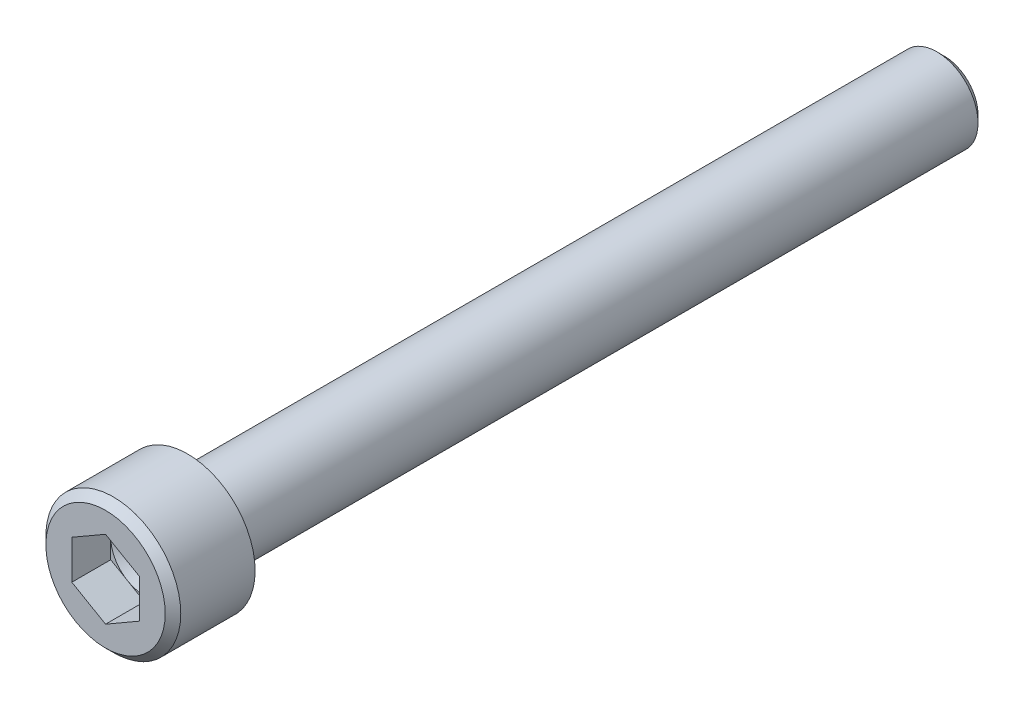
ISO-10303-21;
HEADER;
FILE_DESCRIPTION(('STEP AP214'),'2;1');
FILE_NAME('part.step','',(''),(''),'','','');
FILE_SCHEMA(('AUTOMOTIVE_DESIGN { 1 0 10303 214 1 1 1 1 }'));
ENDSEC;
DATA;
#1=APPLICATION_CONTEXT('core data for automotive mechanical design processes');
#2=APPLICATION_PROTOCOL_DEFINITION('international standard','automotive_design',2000,#1);
#3=PRODUCT_CONTEXT('',#1,'mechanical');
#4=PRODUCT('Part','Part','',(#3));
#5=PRODUCT_RELATED_PRODUCT_CATEGORY('part','',(#4));
#6=PRODUCT_DEFINITION_FORMATION('','',#4);
#7=PRODUCT_DEFINITION_CONTEXT('part definition',#1,'design');
#8=PRODUCT_DEFINITION('design','',#6,#7);
#9=PRODUCT_DEFINITION_SHAPE('','',#8);
#10=(LENGTH_UNIT() NAMED_UNIT(*) SI_UNIT(.MILLI.,.METRE.));
#11=(NAMED_UNIT(*) PLANE_ANGLE_UNIT() SI_UNIT($,.RADIAN.));
#12=(NAMED_UNIT(*) SI_UNIT($,.STERADIAN.) SOLID_ANGLE_UNIT());
#13=UNCERTAINTY_MEASURE_WITH_UNIT(LENGTH_MEASURE(1.E-05),#10,'distance_accuracy_value','');
#14=(GEOMETRIC_REPRESENTATION_CONTEXT(3) GLOBAL_UNCERTAINTY_ASSIGNED_CONTEXT((#13)) GLOBAL_UNIT_ASSIGNED_CONTEXT((#10,
#11,#12)) REPRESENTATION_CONTEXT('',''));
#15=CARTESIAN_POINT('',(0.,0.,0.));
#16=DIRECTION('',(0.,0.,1.));
#17=DIRECTION('',(1.,0.,0.));
#18=AXIS2_PLACEMENT_3D('',#15,#16,#17);
#19=CARTESIAN_POINT('',(0.,0.,2.54));
#20=DIRECTION('',(0.,0.,1.));
#21=DIRECTION('',(1.,0.,0.));
#22=AXIS2_PLACEMENT_3D('',#19,#20,#21);
#23=PLANE('',#22);
#24=DIRECTION('',(0.,1.,0.));
#25=VECTOR('',#24,1.);
#26=CARTESIAN_POINT('',(-1.9812,0.,2.54));
#27=LINE('',#26,#25);
#28=CARTESIAN_POINT('',(-1.9812,0.,2.54));
#29=VERTEX_POINT('',#28);
#30=CARTESIAN_POINT('',(-1.9812,1.14384635331848,2.54));
#31=VERTEX_POINT('',#30);
#32=EDGE_CURVE('E399',#29,#31,#27,.T.);
#33=ORIENTED_EDGE('',*,*,#32,.F.);
#34=CARTESIAN_POINT('',(0.,0.,2.54));
#35=DIRECTION('',(0.,0.,-1.));
#36=DIRECTION('',(-1.,0.,0.));
#37=AXIS2_PLACEMENT_3D('',#34,#35,#36);
#38=CIRCLE('',#37,1.9812);
#39=CARTESIAN_POINT('',(-0.9906,1.71576952997773,2.54));
#40=VERTEX_POINT('',#39);
#41=EDGE_CURVE('E33',#29,#40,#38,.T.);
#42=ORIENTED_EDGE('',*,*,#41,.T.);
#43=DIRECTION('',(0.866025403784439,0.5,0.));
#44=VECTOR('',#43,1.);
#45=CARTESIAN_POINT('',(0.163354175866616,2.38200528404682,2.54));
#46=LINE('',#45,#44);
#47=EDGE_CURVE('E395',#31,#40,#46,.T.);
#48=ORIENTED_EDGE('',*,*,#47,.F.);
#49=EDGE_LOOP('',(#33,#42,#48));
#50=FACE_BOUND('',#49,.T.);
#51=ADVANCED_FACE('F17',(#50),#23,.T.);
#52=CARTESIAN_POINT('',(0.,2.28769270663697,2.54));
#53=VERTEX_POINT('',#52);
#54=EDGE_CURVE('E392',#40,#53,#46,.T.);
#55=ORIENTED_EDGE('',*,*,#54,.F.);
#56=CARTESIAN_POINT('',(0.9906,1.71576952997773,2.54));
#57=VERTEX_POINT('',#56);
#58=EDGE_CURVE('E224',#40,#57,#38,.T.);
#59=ORIENTED_EDGE('',*,*,#58,.T.);
#60=DIRECTION('',(0.866025403784439,-0.5,0.));
#61=VECTOR('',#60,1.);
#62=CARTESIAN_POINT('',(-0.163354175866613,2.38200528404681,2.54));
#63=LINE('',#62,#61);
#64=EDGE_CURVE('E384',#53,#57,#63,.T.);
#65=ORIENTED_EDGE('',*,*,#64,.F.);
#66=EDGE_LOOP('',(#55,#59,#65));
#67=FACE_BOUND('',#66,.T.);
#68=ADVANCED_FACE('F105',(#67),#23,.T.);
#69=CARTESIAN_POINT('',(1.9812,1.14384635331849,2.54));
#70=VERTEX_POINT('',#69);
#71=EDGE_CURVE('E190',#57,#70,#63,.T.);
#72=ORIENTED_EDGE('',*,*,#71,.F.);
#73=CARTESIAN_POINT('',(1.9812,0.,2.54));
#74=VERTEX_POINT('',#73);
#75=EDGE_CURVE('E381',#57,#74,#38,.T.);
#76=ORIENTED_EDGE('',*,*,#75,.T.);
#77=DIRECTION('',(0.,-1.,0.));
#78=VECTOR('',#77,1.);
#79=CARTESIAN_POINT('',(1.9812,0.,2.54));
#80=LINE('',#79,#78);
#81=EDGE_CURVE('E160',#70,#74,#80,.T.);
#82=ORIENTED_EDGE('',*,*,#81,.F.);
#83=EDGE_LOOP('',(#72,#76,#82));
#84=FACE_BOUND('',#83,.T.);
#85=ADVANCED_FACE('F111',(#84),#23,.T.);
#86=CARTESIAN_POINT('',(1.9812,-1.14384635331849,2.54));
#87=VERTEX_POINT('',#86);
#88=EDGE_CURVE('E155',#74,#87,#80,.T.);
#89=ORIENTED_EDGE('',*,*,#88,.F.);
#90=CARTESIAN_POINT('',(0.9906,-1.71576952997773,2.54));
#91=VERTEX_POINT('',#90);
#92=EDGE_CURVE('E417',#74,#91,#38,.T.);
#93=ORIENTED_EDGE('',*,*,#92,.T.);
#94=DIRECTION('',(-0.866025403784438,-0.5,0.));
#95=VECTOR('',#94,1.);
#96=CARTESIAN_POINT('',(2.14455417586661,-1.04953377590865,2.54));
#97=LINE('',#96,#95);
#98=EDGE_CURVE('E148',#87,#91,#97,.T.);
#99=ORIENTED_EDGE('',*,*,#98,.F.);
#100=EDGE_LOOP('',(#89,#93,#99));
#101=FACE_BOUND('',#100,.T.);
#102=ADVANCED_FACE('F129',(#101),#23,.T.);
#103=CARTESIAN_POINT('',(0.,-2.28769270663697,2.54));
#104=VERTEX_POINT('',#103);
#105=EDGE_CURVE('E141',#91,#104,#97,.T.);
#106=ORIENTED_EDGE('',*,*,#105,.F.);
#107=CARTESIAN_POINT('',(-0.9906,-1.71576952997773,2.54));
#108=VERTEX_POINT('',#107);
#109=EDGE_CURVE('E143',#91,#108,#38,.T.);
#110=ORIENTED_EDGE('',*,*,#109,.T.);
#111=DIRECTION('',(-0.866025403784439,0.5,0.));
#112=VECTOR('',#111,1.);
#113=CARTESIAN_POINT('',(-2.14455417586661,-1.04953377590865,2.54));
#114=LINE('',#113,#112);
#115=EDGE_CURVE('E145',#104,#108,#114,.T.);
#116=ORIENTED_EDGE('',*,*,#115,.F.);
#117=EDGE_LOOP('',(#106,#110,#116));
#118=FACE_BOUND('',#117,.T.);
#119=ADVANCED_FACE('F119',(#118),#23,.T.);
#120=CARTESIAN_POINT('',(0.,0.,4.826));
#121=DIRECTION('',(0.,0.,1.));
#122=DIRECTION('',(1.,0.,0.));
#123=AXIS2_PLACEMENT_3D('',#120,#121,#122);
#124=PLANE('',#123);
#125=CARTESIAN_POINT('',(0.,0.,4.826));
#126=DIRECTION('',(0.,0.,1.));
#127=DIRECTION('',(1.,0.,0.));
#128=AXIS2_PLACEMENT_3D('',#125,#126,#127);
#129=CIRCLE('',#128,3.5052);
#130=CARTESIAN_POINT('',(3.5052,0.,4.826));
#131=VERTEX_POINT('',#130);
#132=EDGE_CURVE('E211',#131,#131,#129,.T.);
#133=ORIENTED_EDGE('',*,*,#132,.T.);
#134=EDGE_LOOP('',(#133));
#135=FACE_BOUND('',#134,.T.);
#136=DIRECTION('',(0.866025403784439,0.5,0.));
#137=VECTOR('',#136,1.);
#138=CARTESIAN_POINT('',(0.163354175866616,2.38200528404682,4.826));
#139=LINE('',#138,#137);
#140=CARTESIAN_POINT('',(-1.9812,1.14384635331848,4.826));
#141=VERTEX_POINT('',#140);
#142=CARTESIAN_POINT('',(0.,2.28769270663697,4.826));
#143=VERTEX_POINT('',#142);
#144=EDGE_CURVE('E172',#141,#143,#139,.T.);
#145=ORIENTED_EDGE('',*,*,#144,.T.);
#146=DIRECTION('',(0.866025403784439,-0.5,0.));
#147=VECTOR('',#146,1.);
#148=CARTESIAN_POINT('',(-0.163354175866613,2.38200528404681,4.826));
#149=LINE('',#148,#147);
#150=CARTESIAN_POINT('',(1.9812,1.14384635331849,4.826));
#151=VERTEX_POINT('',#150);
#152=EDGE_CURVE('E168',#143,#151,#149,.T.);
#153=ORIENTED_EDGE('',*,*,#152,.T.);
#154=DIRECTION('',(0.,-1.,0.));
#155=VECTOR('',#154,1.);
#156=CARTESIAN_POINT('',(1.9812,0.,4.826));
#157=LINE('',#156,#155);
#158=CARTESIAN_POINT('',(1.9812,-1.14384635331849,4.826));
#159=VERTEX_POINT('',#158);
#160=EDGE_CURVE('E186',#151,#159,#157,.T.);
#161=ORIENTED_EDGE('',*,*,#160,.T.);
#162=DIRECTION('',(-0.866025403784438,-0.5,0.));
#163=VECTOR('',#162,1.);
#164=CARTESIAN_POINT('',(2.14455417586661,-1.04953377590865,4.826));
#165=LINE('',#164,#163);
#166=CARTESIAN_POINT('',(0.,-2.28769270663697,4.826));
#167=VERTEX_POINT('',#166);
#168=EDGE_CURVE('E41',#159,#167,#165,.T.);
#169=ORIENTED_EDGE('',*,*,#168,.T.);
#170=DIRECTION('',(-0.866025403784439,0.5,0.));
#171=VECTOR('',#170,1.);
#172=CARTESIAN_POINT('',(-2.14455417586661,-1.04953377590865,4.826));
#173=LINE('',#172,#171);
#174=CARTESIAN_POINT('',(-1.9812,-1.14384635331849,4.826));
#175=VERTEX_POINT('',#174);
#176=EDGE_CURVE('E180',#167,#175,#173,.T.);
#177=ORIENTED_EDGE('',*,*,#176,.T.);
#178=DIRECTION('',(0.,1.,0.));
#179=VECTOR('',#178,1.);
#180=CARTESIAN_POINT('',(-1.9812,0.,4.826));
#181=LINE('',#180,#179);
#182=EDGE_CURVE('E176',#175,#141,#181,.T.);
#183=ORIENTED_EDGE('',*,*,#182,.T.);
#184=EDGE_LOOP('',(#145,#153,#161,#169,#177,#183));
#185=FACE_BOUND('',#184,.T.);
#186=ADVANCED_FACE('F128',(#135,#185),#124,.T.);
#187=CARTESIAN_POINT('',(0.,0.,4.826));
#188=DIRECTION('',(0.,0.,-1.));
#189=DIRECTION('',(-1.,0.,0.));
#190=AXIS2_PLACEMENT_3D('',#187,#188,#189);
#191=CYLINDRICAL_SURFACE('',#190,3.9624);
#192=CARTESIAN_POINT('',(0.,0.,4.3688));
#193=DIRECTION('',(0.,0.,1.));
#194=DIRECTION('',(1.,0.,0.));
#195=AXIS2_PLACEMENT_3D('',#192,#193,#194);
#196=CIRCLE('',#195,3.9624);
#197=CARTESIAN_POINT('',(3.9624,0.,4.3688));
#198=VERTEX_POINT('',#197);
#199=EDGE_CURVE('E215',#198,#198,#196,.F.);
#200=ORIENTED_EDGE('',*,*,#199,.T.);
#201=EDGE_LOOP('',(#200));
#202=FACE_BOUND('',#201,.T.);
#203=CARTESIAN_POINT('',(0.,0.,0.));
#204=DIRECTION('',(0.,0.,1.));
#205=DIRECTION('',(1.,0.,0.));
#206=AXIS2_PLACEMENT_3D('',#203,#204,#205);
#207=CIRCLE('',#206,3.9624);
#208=CARTESIAN_POINT('',(3.9624,0.,0.));
#209=VERTEX_POINT('',#208);
#210=EDGE_CURVE('E207',#209,#209,#207,.T.);
#211=ORIENTED_EDGE('',*,*,#210,.T.);
#212=EDGE_LOOP('',(#211));
#213=FACE_BOUND('',#212,.T.);
#214=ADVANCED_FACE('F134',(#202,#213),#191,.T.);
#215=CARTESIAN_POINT('',(0.,0.,0.));
#216=DIRECTION('',(0.,0.,1.));
#217=DIRECTION('',(1.,0.,0.));
#218=AXIS2_PLACEMENT_3D('',#215,#216,#217);
#219=PLANE('',#218);
#220=CARTESIAN_POINT('',(0.,0.,0.));
#221=DIRECTION('',(0.,0.,1.));
#222=DIRECTION('',(1.,0.,0.));
#223=AXIS2_PLACEMENT_3D('',#220,#221,#222);
#224=CIRCLE('',#223,2.5654);
#225=CARTESIAN_POINT('',(2.5654,0.,0.));
#226=VERTEX_POINT('',#225);
#227=EDGE_CURVE('E223',#226,#226,#224,.T.);
#228=ORIENTED_EDGE('',*,*,#227,.T.);
#229=EDGE_LOOP('',(#228));
#230=FACE_BOUND('',#229,.T.);
#231=ORIENTED_EDGE('',*,*,#210,.F.);
#232=EDGE_LOOP('',(#231));
#233=FACE_BOUND('',#232,.T.);
#234=ADVANCED_FACE('F325',(#230,#233),#219,.F.);
#235=CARTESIAN_POINT('',(0.,0.,4.826));
#236=DIRECTION('',(0.,0.,-1.));
#237=DIRECTION('',(-1.,0.,0.));
#238=AXIS2_PLACEMENT_3D('',#235,#236,#237);
#239=CONICAL_SURFACE('',#238,3.5052,0.785398163397449);
#240=ORIENTED_EDGE('',*,*,#199,.F.);
#241=EDGE_LOOP('',(#240));
#242=FACE_BOUND('',#241,.T.);
#243=ORIENTED_EDGE('',*,*,#132,.F.);
#244=EDGE_LOOP('',(#243));
#245=FACE_BOUND('',#244,.T.);
#246=ADVANCED_FACE('F316',(#242,#245),#239,.T.);
#247=CARTESIAN_POINT('',(-0.163354175866613,2.38200528404681,2.54));
#248=DIRECTION('',(-0.5,-0.866025403784439,0.));
#249=DIRECTION('',(0.866025403784439,-0.5,0.));
#250=AXIS2_PLACEMENT_3D('',#247,#248,#249);
#251=PLANE('',#250);
#252=ORIENTED_EDGE('',*,*,#152,.F.);
#253=DIRECTION('',(0.,0.,1.));
#254=VECTOR('',#253,1.);
#255=CARTESIAN_POINT('',(0.,2.28769270663697,2.54));
#256=LINE('',#255,#254);
#257=EDGE_CURVE('E204',#53,#143,#256,.T.);
#258=ORIENTED_EDGE('',*,*,#257,.F.);
#259=ORIENTED_EDGE('',*,*,#64,.T.);
#260=ORIENTED_EDGE('',*,*,#71,.T.);
#261=DIRECTION('',(0.,0.,1.));
#262=VECTOR('',#261,1.);
#263=CARTESIAN_POINT('',(1.9812,1.14384635331849,2.54));
#264=LINE('',#263,#262);
#265=EDGE_CURVE('E167',#70,#151,#264,.T.);
#266=ORIENTED_EDGE('',*,*,#265,.T.);
#267=EDGE_LOOP('',(#252,#258,#259,#260,#266));
#268=FACE_BOUND('',#267,.T.);
#269=ADVANCED_FACE('F307',(#268),#251,.T.);
#270=CARTESIAN_POINT('',(0.163354175866616,2.38200528404682,2.54));
#271=DIRECTION('',(0.5,-0.866025403784438,0.));
#272=DIRECTION('',(0.866025403784438,0.5,0.));
#273=AXIS2_PLACEMENT_3D('',#270,#271,#272);
#274=PLANE('',#273);
#275=ORIENTED_EDGE('',*,*,#144,.F.);
#276=DIRECTION('',(0.,0.,1.));
#277=VECTOR('',#276,1.);
#278=CARTESIAN_POINT('',(-1.9812,1.14384635331848,2.54));
#279=LINE('',#278,#277);
#280=EDGE_CURVE('E201',#31,#141,#279,.T.);
#281=ORIENTED_EDGE('',*,*,#280,.F.);
#282=ORIENTED_EDGE('',*,*,#47,.T.);
#283=ORIENTED_EDGE('',*,*,#54,.T.);
#284=ORIENTED_EDGE('',*,*,#257,.T.);
#285=EDGE_LOOP('',(#275,#281,#282,#283,#284));
#286=FACE_BOUND('',#285,.T.);
#287=ADVANCED_FACE('F298',(#286),#274,.T.);
#288=CARTESIAN_POINT('',(-1.9812,0.,2.54));
#289=DIRECTION('',(1.,0.,0.));
#290=DIRECTION('',(0.,1.,0.));
#291=AXIS2_PLACEMENT_3D('',#288,#289,#290);
#292=PLANE('',#291);
#293=ORIENTED_EDGE('',*,*,#182,.F.);
#294=DIRECTION('',(0.,0.,1.));
#295=VECTOR('',#294,1.);
#296=CARTESIAN_POINT('',(-1.9812,-1.14384635331849,2.54));
#297=LINE('',#296,#295);
#298=CARTESIAN_POINT('',(-1.9812,-1.14384635331849,2.54));
#299=VERTEX_POINT('',#298);
#300=EDGE_CURVE('E198',#299,#175,#297,.T.);
#301=ORIENTED_EDGE('',*,*,#300,.F.);
#302=EDGE_CURVE('E400',#299,#29,#27,.T.);
#303=ORIENTED_EDGE('',*,*,#302,.T.);
#304=ORIENTED_EDGE('',*,*,#32,.T.);
#305=ORIENTED_EDGE('',*,*,#280,.T.);
#306=EDGE_LOOP('',(#293,#301,#303,#304,#305));
#307=FACE_BOUND('',#306,.T.);
#308=ADVANCED_FACE('F289',(#307),#292,.T.);
#309=CARTESIAN_POINT('',(-2.14455417586661,-1.04953377590865,2.54));
#310=DIRECTION('',(0.5,0.866025403784439,0.));
#311=DIRECTION('',(-0.866025403784439,0.5,0.));
#312=AXIS2_PLACEMENT_3D('',#309,#310,#311);
#313=PLANE('',#312);
#314=ORIENTED_EDGE('',*,*,#176,.F.);
#315=DIRECTION('',(0.,0.,1.));
#316=VECTOR('',#315,1.);
#317=CARTESIAN_POINT('',(0.,-2.28769270663697,2.54));
#318=LINE('',#317,#316);
#319=EDGE_CURVE('E195',#104,#167,#318,.T.);
#320=ORIENTED_EDGE('',*,*,#319,.F.);
#321=ORIENTED_EDGE('',*,*,#115,.T.);
#322=EDGE_CURVE('E403',#108,#299,#114,.T.);
#323=ORIENTED_EDGE('',*,*,#322,.T.);
#324=ORIENTED_EDGE('',*,*,#300,.T.);
#325=EDGE_LOOP('',(#314,#320,#321,#323,#324));
#326=FACE_BOUND('',#325,.T.);
#327=ADVANCED_FACE('F281',(#326),#313,.T.);
#328=CARTESIAN_POINT('',(2.14455417586661,-1.04953377590865,2.54));
#329=DIRECTION('',(-0.5,0.866025403784438,0.));
#330=DIRECTION('',(-0.866025403784438,-0.5,0.));
#331=AXIS2_PLACEMENT_3D('',#328,#329,#330);
#332=PLANE('',#331);
#333=ORIENTED_EDGE('',*,*,#168,.F.);
#334=DIRECTION('',(0.,0.,1.));
#335=VECTOR('',#334,1.);
#336=CARTESIAN_POINT('',(1.9812,-1.14384635331849,2.54));
#337=LINE('',#336,#335);
#338=EDGE_CURVE('E151',#87,#159,#337,.T.);
#339=ORIENTED_EDGE('',*,*,#338,.F.);
#340=ORIENTED_EDGE('',*,*,#98,.T.);
#341=ORIENTED_EDGE('',*,*,#105,.T.);
#342=ORIENTED_EDGE('',*,*,#319,.T.);
#343=EDGE_LOOP('',(#333,#339,#340,#341,#342));
#344=FACE_BOUND('',#343,.T.);
#345=ADVANCED_FACE('F124',(#344),#332,.T.);
#346=CARTESIAN_POINT('',(1.9812,0.,2.54));
#347=DIRECTION('',(-1.,0.,0.));
#348=DIRECTION('',(0.,-1.,0.));
#349=AXIS2_PLACEMENT_3D('',#346,#347,#348);
#350=PLANE('',#349);
#351=ORIENTED_EDGE('',*,*,#160,.F.);
#352=ORIENTED_EDGE('',*,*,#265,.F.);
#353=ORIENTED_EDGE('',*,*,#81,.T.);
#354=ORIENTED_EDGE('',*,*,#88,.T.);
#355=ORIENTED_EDGE('',*,*,#338,.T.);
#356=EDGE_LOOP('',(#351,#352,#353,#354,#355));
#357=FACE_BOUND('',#356,.T.);
#358=ADVANCED_FACE('F117',(#357),#350,.T.);
#359=ORIENTED_EDGE('',*,*,#322,.F.);
#360=EDGE_CURVE('E218',#108,#29,#38,.T.);
#361=ORIENTED_EDGE('',*,*,#360,.T.);
#362=ORIENTED_EDGE('',*,*,#302,.F.);
#363=EDGE_LOOP('',(#359,#361,#362));
#364=FACE_BOUND('',#363,.T.);
#365=ADVANCED_FACE('F108',(#364),#23,.T.);
#366=CARTESIAN_POINT('',(0.,0.,-44.45));
#367=DIRECTION('',(0.,0.,1.));
#368=DIRECTION('',(1.,0.,0.));
#369=AXIS2_PLACEMENT_3D('',#366,#367,#368);
#370=CYLINDRICAL_SURFACE('',#369,2.413);
#371=CARTESIAN_POINT('',(0.,0.,-44.02105761938));
#372=DIRECTION('',(0.,0.,-1.));
#373=DIRECTION('',(-1.,0.,0.));
#374=AXIS2_PLACEMENT_3D('',#371,#372,#373);
#375=CIRCLE('',#374,2.413);
#376=CARTESIAN_POINT('',(-2.413,0.,-44.02105761938));
#377=VERTEX_POINT('',#376);
#378=EDGE_CURVE('E11',#377,#377,#375,.F.);
#379=ORIENTED_EDGE('',*,*,#378,.T.);
#380=EDGE_LOOP('',(#379));
#381=FACE_BOUND('',#380,.T.);
#382=CARTESIAN_POINT('',(0.,0.,-0.152399999999997));
#383=DIRECTION('',(0.,0.,1.));
#384=DIRECTION('',(1.,0.,0.));
#385=AXIS2_PLACEMENT_3D('',#382,#383,#384);
#386=CIRCLE('',#385,2.413);
#387=CARTESIAN_POINT('',(2.413,0.,-0.152399999999997));
#388=VERTEX_POINT('',#387);
#389=EDGE_CURVE('E219',#388,#388,#386,.F.);
#390=ORIENTED_EDGE('',*,*,#389,.T.);
#391=EDGE_LOOP('',(#390));
#392=FACE_BOUND('',#391,.T.);
#393=ADVANCED_FACE('F101',(#381,#392),#370,.T.);
#394=CARTESIAN_POINT('',(0.,0.,-44.45));
#395=DIRECTION('',(0.,0.,-1.));
#396=DIRECTION('',(1.,0.,0.));
#397=AXIS2_PLACEMENT_3D('',#394,#395,#396);
#398=PLANE('',#397);
#399=CARTESIAN_POINT('',(0.,0.,-44.45));
#400=DIRECTION('',(0.,0.,-1.));
#401=DIRECTION('',(-1.,0.,0.));
#402=AXIS2_PLACEMENT_3D('',#399,#400,#401);
#403=CIRCLE('',#402,1.98405761938);
#404=CARTESIAN_POINT('',(-1.98405761938,0.,-44.45));
#405=VERTEX_POINT('',#404);
#406=EDGE_CURVE('E26',#405,#405,#403,.T.);
#407=ORIENTED_EDGE('',*,*,#406,.T.);
#408=EDGE_LOOP('',(#407));
#409=FACE_BOUND('',#408,.T.);
#410=ADVANCED_FACE('F94',(#409),#398,.T.);
#411=CARTESIAN_POINT('',(0.,0.,1.39615364668151));
#412=DIRECTION('',(0.,0.,1.));
#413=DIRECTION('',(1.,0.,0.));
#414=AXIS2_PLACEMENT_3D('',#411,#412,#413);
#415=CONICAL_SURFACE('',#414,0.,1.0471975511966);
#416=ORIENTED_EDGE('',*,*,#41,.F.);
#417=ORIENTED_EDGE('',*,*,#360,.F.);
#418=ORIENTED_EDGE('',*,*,#109,.F.);
#419=ORIENTED_EDGE('',*,*,#92,.F.);
#420=ORIENTED_EDGE('',*,*,#75,.F.);
#421=ORIENTED_EDGE('',*,*,#58,.F.);
#422=EDGE_LOOP('',(#416,#417,#418,#419,#420,#421));
#423=FACE_BOUND('',#422,.T.);
#424=CARTESIAN_POINT('',(0.,0.,1.39615364668151));
#425=VERTEX_POINT('',#424);
#426=VERTEX_LOOP('',#425);
#427=FACE_BOUND('',#426,.T.);
#428=ADVANCED_FACE('F91',(#423,#427),#415,.F.);
#429=CARTESIAN_POINT('',(0.,0.,-0.152399999999997));
#430=DIRECTION('',(0.,0.,1.));
#431=DIRECTION('',(1.,0.,0.));
#432=AXIS2_PLACEMENT_3D('',#429,#430,#431);
#433=TOROIDAL_SURFACE('',#432,2.5654,0.1524);
#434=ORIENTED_EDGE('',*,*,#227,.F.);
#435=EDGE_LOOP('',(#434));
#436=FACE_BOUND('',#435,.T.);
#437=ORIENTED_EDGE('',*,*,#389,.F.);
#438=EDGE_LOOP('',(#437));
#439=FACE_BOUND('',#438,.T.);
#440=ADVANCED_FACE('F93',(#436,#439),#433,.F.);
#441=CARTESIAN_POINT('',(0.,0.,-44.45));
#442=DIRECTION('',(0.,0.,1.));
#443=DIRECTION('',(1.,0.,0.));
#444=AXIS2_PLACEMENT_3D('',#441,#442,#443);
#445=CONICAL_SURFACE('',#444,1.98405761938,0.785398163397445);
#446=ORIENTED_EDGE('',*,*,#378,.F.);
#447=EDGE_LOOP('',(#446));
#448=FACE_BOUND('',#447,.T.);
#449=ORIENTED_EDGE('',*,*,#406,.F.);
#450=EDGE_LOOP('',(#449));
#451=FACE_BOUND('',#450,.T.);
#452=ADVANCED_FACE('F19',(#448,#451),#445,.T.);
#453=CLOSED_SHELL('',(#51,#68,#85,#102,#119,#186,#214,#234,#246,#269,#287,#308,#327,#345,#358,
#365,#393,#410,#428,#440,#452));
#454=MANIFOLD_SOLID_BREP('B1',#453);
#455=ADVANCED_BREP_SHAPE_REPRESENTATION('',(#18,#454),#14);
#456=SHAPE_DEFINITION_REPRESENTATION(#9,#455);
ENDSEC;
END-ISO-10303-21;
